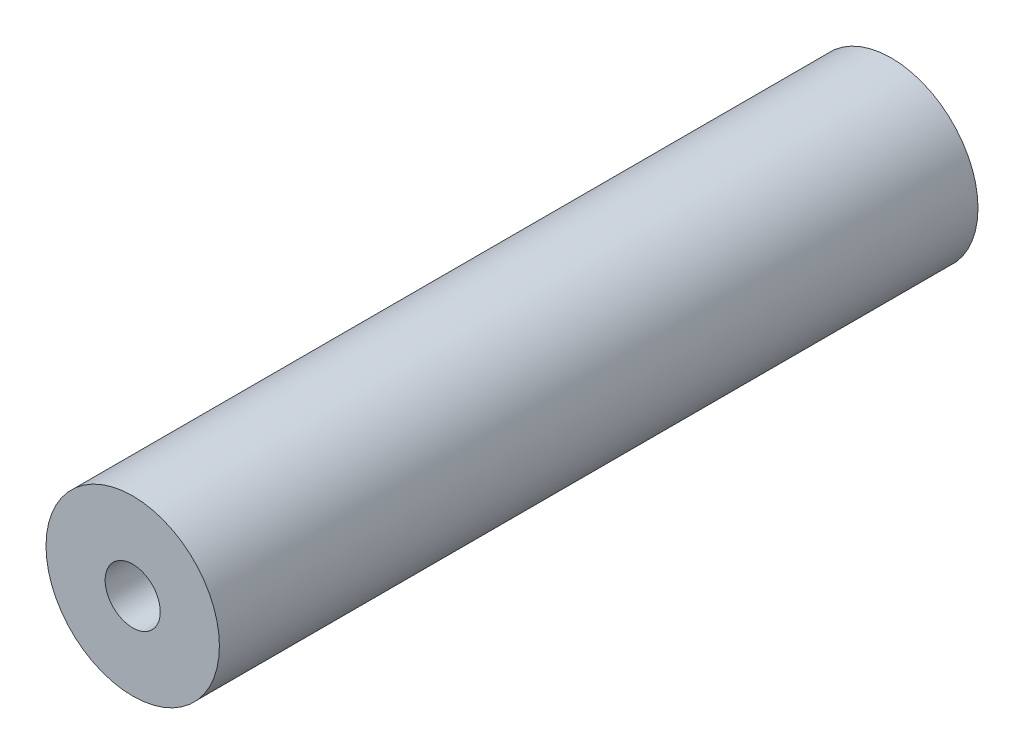
ISO-10303-21;
HEADER;
FILE_DESCRIPTION(('STEP AP214'),'2;1');
FILE_NAME('part.step','',(''),(''),'','','');
FILE_SCHEMA(('AUTOMOTIVE_DESIGN { 1 0 10303 214 1 1 1 1 }'));
ENDSEC;
DATA;
#1=APPLICATION_CONTEXT('core data for automotive mechanical design processes');
#2=APPLICATION_PROTOCOL_DEFINITION('international standard','automotive_design',2000,#1);
#3=PRODUCT_CONTEXT('',#1,'mechanical');
#4=PRODUCT('Part','Part','',(#3));
#5=PRODUCT_RELATED_PRODUCT_CATEGORY('part','',(#4));
#6=PRODUCT_DEFINITION_FORMATION('','',#4);
#7=PRODUCT_DEFINITION_CONTEXT('part definition',#1,'design');
#8=PRODUCT_DEFINITION('design','',#6,#7);
#9=PRODUCT_DEFINITION_SHAPE('','',#8);
#10=(LENGTH_UNIT() NAMED_UNIT(*) SI_UNIT(.MILLI.,.METRE.));
#11=(NAMED_UNIT(*) PLANE_ANGLE_UNIT() SI_UNIT($,.RADIAN.));
#12=(NAMED_UNIT(*) SI_UNIT($,.STERADIAN.) SOLID_ANGLE_UNIT());
#13=UNCERTAINTY_MEASURE_WITH_UNIT(LENGTH_MEASURE(1.E-05),#10,'distance_accuracy_value','');
#14=(GEOMETRIC_REPRESENTATION_CONTEXT(3) GLOBAL_UNCERTAINTY_ASSIGNED_CONTEXT((#13)) GLOBAL_UNIT_ASSIGNED_CONTEXT((#10,
#11,#12)) REPRESENTATION_CONTEXT('',''));
#15=CARTESIAN_POINT('',(0.,0.,0.));
#16=DIRECTION('',(0.,0.,1.));
#17=DIRECTION('',(1.,0.,0.));
#18=AXIS2_PLACEMENT_3D('',#15,#16,#17);
#19=CARTESIAN_POINT('',(0.,0.,27.78125));
#20=DIRECTION('',(0.,0.,-1.));
#21=DIRECTION('',(-1.,0.,0.));
#22=AXIS2_PLACEMENT_3D('',#19,#20,#21);
#23=CYLINDRICAL_SURFACE('',#22,6.35);
#24=CARTESIAN_POINT('',(0.,0.,27.78125));
#25=DIRECTION('',(0.,0.,1.));
#26=DIRECTION('',(1.,0.,0.));
#27=AXIS2_PLACEMENT_3D('',#24,#25,#26);
#28=CIRCLE('',#27,6.35);
#29=CARTESIAN_POINT('',(6.35,0.,27.78125));
#30=VERTEX_POINT('',#29);
#31=EDGE_CURVE('E11',#30,#30,#28,.T.);
#32=ORIENTED_EDGE('',*,*,#31,.F.);
#33=EDGE_LOOP('',(#32));
#34=FACE_BOUND('',#33,.T.);
#35=CARTESIAN_POINT('',(0.,0.,-27.78125));
#36=DIRECTION('',(0.,0.,1.));
#37=DIRECTION('',(1.,0.,0.));
#38=AXIS2_PLACEMENT_3D('',#35,#36,#37);
#39=CIRCLE('',#38,6.35);
#40=CARTESIAN_POINT('',(6.35,0.,-27.78125));
#41=VERTEX_POINT('',#40);
#42=EDGE_CURVE('E54',#41,#41,#39,.T.);
#43=ORIENTED_EDGE('',*,*,#42,.T.);
#44=EDGE_LOOP('',(#43));
#45=FACE_BOUND('',#44,.T.);
#46=ADVANCED_FACE('F51',(#34,#45),#23,.T.);
#47=CARTESIAN_POINT('',(0.,0.,27.78125));
#48=DIRECTION('',(0.,0.,1.));
#49=DIRECTION('',(1.,0.,0.));
#50=AXIS2_PLACEMENT_3D('',#47,#48,#49);
#51=PLANE('',#50);
#52=CARTESIAN_POINT('',(0.,0.,27.78125));
#53=DIRECTION('',(0.,0.,1.));
#54=DIRECTION('',(1.,0.,0.));
#55=AXIS2_PLACEMENT_3D('',#52,#53,#54);
#56=CIRCLE('',#55,2.01929999999999);
#57=CARTESIAN_POINT('',(2.01929999999999,0.,27.78125));
#58=VERTEX_POINT('',#57);
#59=EDGE_CURVE('E77',#58,#58,#56,.T.);
#60=ORIENTED_EDGE('',*,*,#59,.F.);
#61=EDGE_LOOP('',(#60));
#62=FACE_BOUND('',#61,.T.);
#63=ORIENTED_EDGE('',*,*,#31,.T.);
#64=EDGE_LOOP('',(#63));
#65=FACE_BOUND('',#64,.T.);
#66=ADVANCED_FACE('F99',(#62,#65),#51,.T.);
#67=CARTESIAN_POINT('',(0.,0.,-27.78125));
#68=DIRECTION('',(0.,0.,1.));
#69=DIRECTION('',(1.,0.,0.));
#70=AXIS2_PLACEMENT_3D('',#67,#68,#69);
#71=PLANE('',#70);
#72=CARTESIAN_POINT('',(0.,0.,-27.78125));
#73=DIRECTION('',(0.,0.,-1.));
#74=DIRECTION('',(-1.,0.,0.));
#75=AXIS2_PLACEMENT_3D('',#72,#73,#74);
#76=CIRCLE('',#75,2.01929999999999);
#77=CARTESIAN_POINT('',(-2.01929999999999,0.,-27.78125));
#78=VERTEX_POINT('',#77);
#79=EDGE_CURVE('E76',#78,#78,#76,.T.);
#80=ORIENTED_EDGE('',*,*,#79,.F.);
#81=EDGE_LOOP('',(#80));
#82=FACE_BOUND('',#81,.T.);
#83=ORIENTED_EDGE('',*,*,#42,.F.);
#84=EDGE_LOOP('',(#83));
#85=FACE_BOUND('',#84,.T.);
#86=ADVANCED_FACE('F96',(#82,#85),#71,.F.);
#87=CARTESIAN_POINT('',(0.,0.,-15.75181));
#88=DIRECTION('',(0.,0.,-1.));
#89=DIRECTION('',(-1.,0.,0.));
#90=AXIS2_PLACEMENT_3D('',#87,#88,#89);
#91=CONICAL_SURFACE('',#90,2.01929999999999,1.02974425867665);
#92=CARTESIAN_POINT('',(0.,0.,-14.5384921519976));
#93=VERTEX_POINT('',#92);
#94=VERTEX_LOOP('',#93);
#95=FACE_BOUND('',#94,.T.);
#96=CARTESIAN_POINT('',(0.,0.,-15.75181));
#97=DIRECTION('',(0.,0.,-1.));
#98=DIRECTION('',(-1.,0.,0.));
#99=AXIS2_PLACEMENT_3D('',#96,#97,#98);
#100=CIRCLE('',#99,2.01929999999999);
#101=CARTESIAN_POINT('',(-2.01929999999999,0.,-15.75181));
#102=VERTEX_POINT('',#101);
#103=EDGE_CURVE('E82',#102,#102,#100,.T.);
#104=ORIENTED_EDGE('',*,*,#103,.T.);
#105=EDGE_LOOP('',(#104));
#106=FACE_BOUND('',#105,.T.);
#107=ADVANCED_FACE('F98',(#95,#106),#91,.F.);
#108=CARTESIAN_POINT('',(0.,0.,-27.78125));
#109=DIRECTION('',(0.,0.,-1.));
#110=DIRECTION('',(-1.,0.,0.));
#111=AXIS2_PLACEMENT_3D('',#108,#109,#110);
#112=CYLINDRICAL_SURFACE('',#111,2.01929999999999);
#113=ORIENTED_EDGE('',*,*,#103,.F.);
#114=EDGE_LOOP('',(#113));
#115=FACE_BOUND('',#114,.T.);
#116=ORIENTED_EDGE('',*,*,#79,.T.);
#117=EDGE_LOOP('',(#116));
#118=FACE_BOUND('',#117,.T.);
#119=ADVANCED_FACE('F69',(#115,#118),#112,.F.);
#120=CARTESIAN_POINT('',(0.,0.,15.75181));
#121=DIRECTION('',(0.,0.,1.));
#122=DIRECTION('',(1.,0.,0.));
#123=AXIS2_PLACEMENT_3D('',#120,#121,#122);
#124=CONICAL_SURFACE('',#123,2.01929999999999,1.02974425867665);
#125=CARTESIAN_POINT('',(0.,0.,14.5384921519976));
#126=VERTEX_POINT('',#125);
#127=VERTEX_LOOP('',#126);
#128=FACE_BOUND('',#127,.T.);
#129=CARTESIAN_POINT('',(0.,0.,15.75181));
#130=DIRECTION('',(0.,0.,1.));
#131=DIRECTION('',(1.,0.,0.));
#132=AXIS2_PLACEMENT_3D('',#129,#130,#131);
#133=CIRCLE('',#132,2.01929999999999);
#134=CARTESIAN_POINT('',(2.01929999999999,0.,15.75181));
#135=VERTEX_POINT('',#134);
#136=EDGE_CURVE('E73',#135,#135,#133,.T.);
#137=ORIENTED_EDGE('',*,*,#136,.T.);
#138=EDGE_LOOP('',(#137));
#139=FACE_BOUND('',#138,.T.);
#140=ADVANCED_FACE('F65',(#128,#139),#124,.F.);
#141=CARTESIAN_POINT('',(0.,0.,27.78125));
#142=DIRECTION('',(0.,0.,1.));
#143=DIRECTION('',(1.,0.,0.));
#144=AXIS2_PLACEMENT_3D('',#141,#142,#143);
#145=CYLINDRICAL_SURFACE('',#144,2.01929999999999);
#146=ORIENTED_EDGE('',*,*,#136,.F.);
#147=EDGE_LOOP('',(#146));
#148=FACE_BOUND('',#147,.T.);
#149=ORIENTED_EDGE('',*,*,#59,.T.);
#150=EDGE_LOOP('',(#149));
#151=FACE_BOUND('',#150,.T.);
#152=ADVANCED_FACE('F68',(#148,#151),#145,.F.);
#153=CLOSED_SHELL('',(#46,#66,#86,#107,#119,#140,#152));
#154=MANIFOLD_SOLID_BREP('B2',#153);
#155=ADVANCED_BREP_SHAPE_REPRESENTATION('',(#18,#154),#14);
#156=SHAPE_DEFINITION_REPRESENTATION(#9,#155);
ENDSEC;
END-ISO-10303-21;
